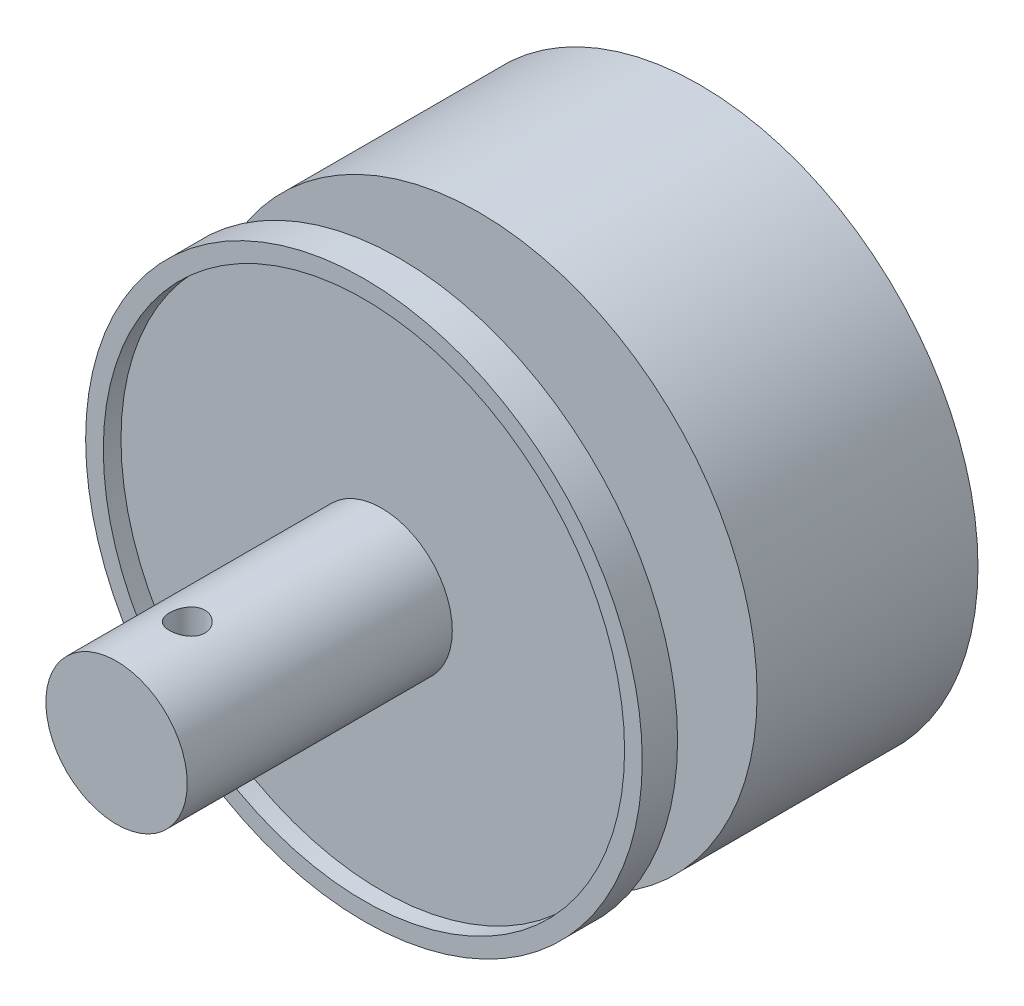
ISO-10303-21;
HEADER;
FILE_DESCRIPTION(('STEP AP214'),'2;1');
FILE_NAME('part.step','',(''),(''),'','','');
FILE_SCHEMA(('AUTOMOTIVE_DESIGN { 1 0 10303 214 1 1 1 1 }'));
ENDSEC;
DATA;
#1=APPLICATION_CONTEXT('core data for automotive mechanical design processes');
#2=APPLICATION_PROTOCOL_DEFINITION('international standard','automotive_design',2000,#1);
#3=PRODUCT_CONTEXT('',#1,'mechanical');
#4=PRODUCT('Part','Part','',(#3));
#5=PRODUCT_RELATED_PRODUCT_CATEGORY('part','',(#4));
#6=PRODUCT_DEFINITION_FORMATION('','',#4);
#7=PRODUCT_DEFINITION_CONTEXT('part definition',#1,'design');
#8=PRODUCT_DEFINITION('design','',#6,#7);
#9=PRODUCT_DEFINITION_SHAPE('','',#8);
#10=(LENGTH_UNIT() NAMED_UNIT(*) SI_UNIT(.MILLI.,.METRE.));
#11=(NAMED_UNIT(*) PLANE_ANGLE_UNIT() SI_UNIT($,.RADIAN.));
#12=(NAMED_UNIT(*) SI_UNIT($,.STERADIAN.) SOLID_ANGLE_UNIT());
#13=UNCERTAINTY_MEASURE_WITH_UNIT(LENGTH_MEASURE(1.E-05),#10,'distance_accuracy_value','');
#14=(GEOMETRIC_REPRESENTATION_CONTEXT(3) GLOBAL_UNCERTAINTY_ASSIGNED_CONTEXT((#13)) GLOBAL_UNIT_ASSIGNED_CONTEXT((#10,
#11,#12)) REPRESENTATION_CONTEXT('',''));
#15=CARTESIAN_POINT('',(0.,0.,0.));
#16=DIRECTION('',(0.,0.,1.));
#17=DIRECTION('',(1.,0.,0.));
#18=AXIS2_PLACEMENT_3D('',#15,#16,#17);
#19=CARTESIAN_POINT('',(0.,0.,25.));
#20=DIRECTION('',(0.,0.,-1.));
#21=DIRECTION('',(-1.,0.,0.));
#22=AXIS2_PLACEMENT_3D('',#19,#20,#21);
#23=CYLINDRICAL_SURFACE('',#22,31.5);
#24=CARTESIAN_POINT('',(0.,0.,25.));
#25=DIRECTION('',(0.,0.,1.));
#26=DIRECTION('',(1.,0.,0.));
#27=AXIS2_PLACEMENT_3D('',#24,#25,#26);
#28=CIRCLE('',#27,31.5);
#29=CARTESIAN_POINT('',(31.5,0.,25.));
#30=VERTEX_POINT('',#29);
#31=EDGE_CURVE('E10',#30,#30,#28,.T.);
#32=ORIENTED_EDGE('',*,*,#31,.F.);
#33=EDGE_LOOP('',(#32));
#34=FACE_BOUND('',#33,.T.);
#35=CARTESIAN_POINT('',(0.,0.,0.));
#36=DIRECTION('',(0.,0.,1.));
#37=DIRECTION('',(1.,0.,0.));
#38=AXIS2_PLACEMENT_3D('',#35,#36,#37);
#39=CIRCLE('',#38,31.5);
#40=CARTESIAN_POINT('',(31.5,0.,0.));
#41=VERTEX_POINT('',#40);
#42=EDGE_CURVE('E41',#41,#41,#39,.T.);
#43=ORIENTED_EDGE('',*,*,#42,.T.);
#44=EDGE_LOOP('',(#43));
#45=FACE_BOUND('',#44,.T.);
#46=ADVANCED_FACE('F30',(#34,#45),#23,.T.);
#47=CARTESIAN_POINT('',(0.,0.,25.));
#48=DIRECTION('',(0.,0.,1.));
#49=DIRECTION('',(1.,0.,0.));
#50=AXIS2_PLACEMENT_3D('',#47,#48,#49);
#51=PLANE('',#50);
#52=CARTESIAN_POINT('',(0.,0.,25.));
#53=DIRECTION('',(0.,0.,1.));
#54=DIRECTION('',(1.,0.,0.));
#55=AXIS2_PLACEMENT_3D('',#52,#53,#54);
#56=CIRCLE('',#55,5.);
#57=CARTESIAN_POINT('',(5.,0.,25.));
#58=VERTEX_POINT('',#57);
#59=EDGE_CURVE('E49',#58,#58,#56,.T.);
#60=ORIENTED_EDGE('',*,*,#59,.F.);
#61=EDGE_LOOP('',(#60));
#62=FACE_BOUND('',#61,.T.);
#63=ORIENTED_EDGE('',*,*,#31,.T.);
#64=EDGE_LOOP('',(#63));
#65=FACE_BOUND('',#64,.T.);
#66=ADVANCED_FACE('F74',(#62,#65),#51,.T.);
#67=CARTESIAN_POINT('',(0.,0.,0.));
#68=DIRECTION('',(0.,0.,1.));
#69=DIRECTION('',(1.,0.,0.));
#70=AXIS2_PLACEMENT_3D('',#67,#68,#69);
#71=PLANE('',#70);
#72=ORIENTED_EDGE('',*,*,#42,.F.);
#73=EDGE_LOOP('',(#72));
#74=FACE_BOUND('',#73,.T.);
#75=ADVANCED_FACE('F79',(#74),#71,.F.);
#76=CARTESIAN_POINT('',(0.,0.,34.));
#77=DIRECTION('',(0.,0.,-1.));
#78=DIRECTION('',(-1.,0.,0.));
#79=AXIS2_PLACEMENT_3D('',#76,#77,#78);
#80=CYLINDRICAL_SURFACE('',#79,5.);
#81=CARTESIAN_POINT('',(0.,0.,34.));
#82=DIRECTION('',(0.,0.,1.));
#83=DIRECTION('',(1.,0.,0.));
#84=AXIS2_PLACEMENT_3D('',#81,#82,#83);
#85=CIRCLE('',#84,5.);
#86=CARTESIAN_POINT('',(5.,0.,34.));
#87=VERTEX_POINT('',#86);
#88=EDGE_CURVE('E46',#87,#87,#85,.T.);
#89=ORIENTED_EDGE('',*,*,#88,.F.);
#90=EDGE_LOOP('',(#89));
#91=FACE_BOUND('',#90,.T.);
#92=ORIENTED_EDGE('',*,*,#59,.T.);
#93=EDGE_LOOP('',(#92));
#94=FACE_BOUND('',#93,.T.);
#95=ADVANCED_FACE('F86',(#91,#94),#80,.T.);
#96=CARTESIAN_POINT('',(0.,0.,38.));
#97=DIRECTION('',(0.,0.,-1.));
#98=DIRECTION('',(-1.,0.,0.));
#99=AXIS2_PLACEMENT_3D('',#96,#97,#98);
#100=CYLINDRICAL_SURFACE('',#99,31.5);
#101=CARTESIAN_POINT('',(0.,0.,38.));
#102=DIRECTION('',(0.,0.,1.));
#103=DIRECTION('',(1.,0.,0.));
#104=AXIS2_PLACEMENT_3D('',#101,#102,#103);
#105=CIRCLE('',#104,31.5);
#106=CARTESIAN_POINT('',(31.5,0.,38.));
#107=VERTEX_POINT('',#106);
#108=EDGE_CURVE('E123',#107,#107,#105,.T.);
#109=ORIENTED_EDGE('',*,*,#108,.F.);
#110=EDGE_LOOP('',(#109));
#111=FACE_BOUND('',#110,.T.);
#112=CARTESIAN_POINT('',(0.,0.,34.));
#113=DIRECTION('',(0.,0.,1.));
#114=DIRECTION('',(1.,0.,0.));
#115=AXIS2_PLACEMENT_3D('',#112,#113,#114);
#116=CIRCLE('',#115,31.5);
#117=CARTESIAN_POINT('',(31.5,0.,34.));
#118=VERTEX_POINT('',#117);
#119=EDGE_CURVE('E119',#118,#118,#116,.T.);
#120=ORIENTED_EDGE('',*,*,#119,.T.);
#121=EDGE_LOOP('',(#120));
#122=FACE_BOUND('',#121,.T.);
#123=ADVANCED_FACE('F90',(#111,#122),#100,.T.);
#124=CARTESIAN_POINT('',(0.,0.,38.));
#125=DIRECTION('',(0.,0.,1.));
#126=DIRECTION('',(1.,0.,0.));
#127=AXIS2_PLACEMENT_3D('',#124,#125,#126);
#128=PLANE('',#127);
#129=CARTESIAN_POINT('',(0.,0.,38.));
#130=DIRECTION('',(0.,0.,1.));
#131=DIRECTION('',(1.,0.,0.));
#132=AXIS2_PLACEMENT_3D('',#129,#130,#131);
#133=CIRCLE('',#132,29.5);
#134=CARTESIAN_POINT('',(29.5,0.,38.));
#135=VERTEX_POINT('',#134);
#136=EDGE_CURVE('E120',#135,#135,#133,.T.);
#137=ORIENTED_EDGE('',*,*,#136,.F.);
#138=EDGE_LOOP('',(#137));
#139=FACE_BOUND('',#138,.T.);
#140=ORIENTED_EDGE('',*,*,#108,.T.);
#141=EDGE_LOOP('',(#140));
#142=FACE_BOUND('',#141,.T.);
#143=ADVANCED_FACE('F96',(#139,#142),#128,.T.);
#144=CARTESIAN_POINT('',(0.,0.,34.));
#145=DIRECTION('',(0.,0.,1.));
#146=DIRECTION('',(1.,0.,0.));
#147=AXIS2_PLACEMENT_3D('',#144,#145,#146);
#148=PLANE('',#147);
#149=ORIENTED_EDGE('',*,*,#88,.T.);
#150=EDGE_LOOP('',(#149));
#151=FACE_BOUND('',#150,.T.);
#152=ORIENTED_EDGE('',*,*,#119,.F.);
#153=EDGE_LOOP('',(#152));
#154=FACE_BOUND('',#153,.T.);
#155=ADVANCED_FACE('F98',(#151,#154),#148,.F.);
#156=CARTESIAN_POINT('',(0.,0.,36.));
#157=DIRECTION('',(0.,0.,1.));
#158=DIRECTION('',(1.,0.,0.));
#159=AXIS2_PLACEMENT_3D('',#156,#157,#158);
#160=CYLINDRICAL_SURFACE('',#159,29.5);
#161=CARTESIAN_POINT('',(0.,0.,36.));
#162=DIRECTION('',(0.,0.,1.));
#163=DIRECTION('',(1.,0.,0.));
#164=AXIS2_PLACEMENT_3D('',#161,#162,#163);
#165=CIRCLE('',#164,29.5);
#166=CARTESIAN_POINT('',(29.5,0.,36.));
#167=VERTEX_POINT('',#166);
#168=EDGE_CURVE('E118',#167,#167,#165,.T.);
#169=ORIENTED_EDGE('',*,*,#168,.F.);
#170=EDGE_LOOP('',(#169));
#171=FACE_BOUND('',#170,.T.);
#172=ORIENTED_EDGE('',*,*,#136,.T.);
#173=EDGE_LOOP('',(#172));
#174=FACE_BOUND('',#173,.T.);
#175=ADVANCED_FACE('F101',(#171,#174),#160,.F.);
#176=CARTESIAN_POINT('',(0.,0.,36.));
#177=DIRECTION('',(0.,0.,1.));
#178=DIRECTION('',(1.,0.,0.));
#179=AXIS2_PLACEMENT_3D('',#176,#177,#178);
#180=PLANE('',#179);
#181=CARTESIAN_POINT('',(0.,0.,36.));
#182=DIRECTION('',(0.,0.,1.));
#183=DIRECTION('',(1.,0.,0.));
#184=AXIS2_PLACEMENT_3D('',#181,#182,#183);
#185=CIRCLE('',#184,8.);
#186=CARTESIAN_POINT('',(8.,0.,36.));
#187=VERTEX_POINT('',#186);
#188=EDGE_CURVE('E115',#187,#187,#185,.T.);
#189=ORIENTED_EDGE('',*,*,#188,.F.);
#190=EDGE_LOOP('',(#189));
#191=FACE_BOUND('',#190,.T.);
#192=ORIENTED_EDGE('',*,*,#168,.T.);
#193=EDGE_LOOP('',(#192));
#194=FACE_BOUND('',#193,.T.);
#195=ADVANCED_FACE('F70',(#191,#194),#180,.T.);
#196=CARTESIAN_POINT('',(0.,0.,66.));
#197=DIRECTION('',(0.,0.,-1.));
#198=DIRECTION('',(-1.,0.,0.));
#199=AXIS2_PLACEMENT_3D('',#196,#197,#198);
#200=CYLINDRICAL_SURFACE('',#199,8.);
#201=CARTESIAN_POINT('',(0.,-8.,60.));
#202=CARTESIAN_POINT('',(0.11050145155965,-7.99999813157349,59.9999968990158));
#203=CARTESIAN_POINT('',(0.22103754377436,-7.99768770842435,59.990811265635));
#204=CARTESIAN_POINT('',(0.438941765027386,-7.98869485106526,59.954366464924));
#205=CARTESIAN_POINT('',(0.546308062494328,-7.98200993893301,59.9270970539495));
#206=CARTESIAN_POINT('',(0.754694496243445,-7.96500835109376,59.8554143287172));
#207=CARTESIAN_POINT('',(0.855722084573345,-7.95469603789411,59.811021601713));
#208=CARTESIAN_POINT('',(1.04889617587258,-7.93153791743495,59.7064248132736));
#209=CARTESIAN_POINT('',(1.14104237913169,-7.91869202472208,59.646220218508));
#210=CARTESIAN_POINT('',(1.3157359030679,-7.89156551455591,59.5103989471278));
#211=CARTESIAN_POINT('',(1.39807425341475,-7.87726276197501,59.4345179000546));
#212=CARTESIAN_POINT('',(1.54899856960443,-7.84898160157248,59.270063726788));
#213=CARTESIAN_POINT('',(1.61758298259893,-7.83500323053157,59.1814891694041));
#214=CARTESIAN_POINT('',(1.74003539039864,-7.80873034264224,58.992539697684));
#215=CARTESIAN_POINT('',(1.79366962123353,-7.79646392619748,58.8920090255884));
#216=CARTESIAN_POINT('',(1.88319587806767,-7.77532659757355,58.6830021177866));
#217=CARTESIAN_POINT('',(1.91909074058686,-7.76645514259224,58.5745271555573));
#218=CARTESIAN_POINT('',(1.97140644907303,-7.7533396892843,58.3550086690645));
#219=CARTESIAN_POINT('',(1.98820302444275,-7.74900654662681,58.244060138616));
#220=CARTESIAN_POINT('',(2.00301570008855,-7.74519149946122,58.0208419080009));
#221=CARTESIAN_POINT('',(2.00103485575749,-7.74570880570571,57.9085724257438));
#222=CARTESIAN_POINT('',(1.97864869951962,-7.75145607355756,57.6887789230062));
#223=CARTESIAN_POINT('',(1.95869112025419,-7.75657150676391,57.5812058380462));
#224=CARTESIAN_POINT('',(1.901632249204,-7.77075612894758,57.3709852654519));
#225=CARTESIAN_POINT('',(1.86452973609253,-7.77982559958985,57.2683381292948));
#226=CARTESIAN_POINT('',(1.77385263724959,-7.80100151874212,57.0696826449972));
#227=CARTESIAN_POINT('',(1.72011555631057,-7.81313769959754,56.9737517709472));
#228=CARTESIAN_POINT('',(1.59780836801994,-7.83906281127988,56.7921083869909));
#229=CARTESIAN_POINT('',(1.52923566507846,-7.85285203112837,56.7063976692437));
#230=CARTESIAN_POINT('',(1.37688456624163,-7.88101174053188,56.5450618457408));
#231=CARTESIAN_POINT('',(1.29272834422116,-7.89538759304001,56.4697940132515));
#232=CARTESIAN_POINT('',(1.11281589000494,-7.92274620771675,56.3343716767148));
#233=CARTESIAN_POINT('',(1.0170593036106,-7.93572892732543,56.2742176343152));
#234=CARTESIAN_POINT('',(0.816154518241867,-7.9589030945892,56.1705992183675));
#235=CARTESIAN_POINT('',(0.710975190944843,-7.96908480170303,56.1271928796608));
#236=CARTESIAN_POINT('',(0.494501344190523,-7.98543889321888,56.0587769257206));
#237=CARTESIAN_POINT('',(0.383207998867325,-7.99161204452374,56.0337637914425));
#238=CARTESIAN_POINT('',(0.160719960520048,-7.999139990285,56.0033899125882));
#239=CARTESIAN_POINT('',(0.0495956266509575,-8.00061404677705,55.9975426318996));
#240=CARTESIAN_POINT('',(-0.172043833068667,-7.99891739752601,56.0043320027407));
#241=CARTESIAN_POINT('',(-0.28255901285945,-7.99574710989128,56.0169669903988));
#242=CARTESIAN_POINT('',(-0.498152358368646,-7.98519441503143,56.0599612111885));
#243=CARTESIAN_POINT('',(-0.603286825291664,-7.97787512247749,56.0900550179693));
#244=CARTESIAN_POINT('',(-0.807009723270006,-7.95984942178846,56.1668094453713));
#245=CARTESIAN_POINT('',(-0.905597492043504,-7.94914267159856,56.2134717390842));
#246=CARTESIAN_POINT('',(-1.09536417923979,-7.92524410568414,56.3229815051663));
#247=CARTESIAN_POINT('',(-1.18638058911443,-7.91201156489243,56.3861014831957));
#248=CARTESIAN_POINT('',(-1.35670215152432,-7.88459345583226,56.5263865450626));
#249=CARTESIAN_POINT('',(-1.43600527863067,-7.87040772335606,56.6035540528225));
#250=CARTESIAN_POINT('',(-1.58265409076363,-7.84225275947695,56.7720026144593));
#251=CARTESIAN_POINT('',(-1.6496584901627,-7.82829738916375,56.8635836040032));
#252=CARTESIAN_POINT('',(-1.76734767868359,-7.80257171169652,57.0569768459543));
#253=CARTESIAN_POINT('',(-1.81803319221057,-7.79080130756035,57.1587886439463));
#254=CARTESIAN_POINT('',(-1.90126856081238,-7.77090792979554,57.3692076298841));
#255=CARTESIAN_POINT('',(-1.93392586220541,-7.76276340389208,57.4777701711253));
#256=CARTESIAN_POINT('',(-1.98046087993836,-7.75102325453578,57.6990795171855));
#257=CARTESIAN_POINT('',(-1.99434270330487,-7.74742663626582,57.8118254013767));
#258=CARTESIAN_POINT('',(-2.00271812044532,-7.74526534938609,58.0348280318069));
#259=CARTESIAN_POINT('',(-1.99775719704015,-7.74655910304352,58.145063246833));
#260=CARTESIAN_POINT('',(-1.96983637108382,-7.75370545343791,58.3630718515573));
#261=CARTESIAN_POINT('',(-1.94687683024902,-7.75955795855809,58.4708452906849));
#262=CARTESIAN_POINT('',(-1.88390842592372,-7.77508347576963,58.6802779454205));
#263=CARTESIAN_POINT('',(-1.84400187290716,-7.78473353648413,58.7819697403203));
#264=CARTESIAN_POINT('',(-1.74835321814009,-7.80677007633105,58.9772871769516));
#265=CARTESIAN_POINT('',(-1.69260892004558,-7.81915693494364,59.0709116975826));
#266=CARTESIAN_POINT('',(-1.56515699818284,-7.8456751235135,59.2500728386694));
#267=CARTESIAN_POINT('',(-1.493070883883,-7.85984353109009,59.3353347645653));
#268=CARTESIAN_POINT('',(-1.33571916158631,-7.88810702995048,59.4927293930605));
#269=CARTESIAN_POINT('',(-1.25045042834819,-7.90220210302746,59.564858973484));
#270=CARTESIAN_POINT('',(-1.06729011560345,-7.92903540863551,59.6952150780861));
#271=CARTESIAN_POINT('',(-0.969197896421842,-7.94174444487824,59.7531661515621));
#272=CARTESIAN_POINT('',(-0.764354746013962,-7.96406566633491,59.8516632839207));
#273=CARTESIAN_POINT('',(-0.657610084582313,-7.97368006933042,59.8922218141981));
#274=CARTESIAN_POINT('',(-0.459213670991288,-7.98730746087389,59.9487624404395));
#275=CARTESIAN_POINT('',(-0.368506894544084,-7.99203446736921,59.9679349907379));
#276=CARTESIAN_POINT('',(-0.185208095381703,-7.99838140309265,59.9935545914959));
#277=CARTESIAN_POINT('',(-0.0926162149901467,-8.00000156601193,60.0000025990737));
#278=CARTESIAN_POINT('',(0.,-8.,60.));
#279=B_SPLINE_CURVE_WITH_KNOTS('',3,(#201,#202,#203,#204,#205,#206,#207,#208,#209,#210,#211,
#212,#213,#214,#215,#216,#217,#218,#219,#220,#221,#222,#223,#224,#225,#226,#227,#228,#229,#230,
#231,#232,#233,#234,#235,#236,#237,#238,#239,#240,#241,#242,#243,#244,#245,#246,#247,#248,#249,
#250,#251,#252,#253,#254,#255,#256,#257,#258,#259,#260,#261,#262,#263,#264,#265,#266,#267,#268,
#269,#270,#271,#272,#273,#274,#275,#276,#277,#278),.UNSPECIFIED.,.T.,.F.,(4,2,2,2,2,2,2,2,2,2,2,
2,2,2,2,2,2,2,2,2,2,2,2,2,2,2,2,2,2,2,2,2,2,2,2,2,2,2,4),(0.,0.33116494996252,0.662517650351866,
0.99347320304814,1.32443992022577,1.66152580582852,1.99864972773415,2.34078196727743,
2.68285948225824,3.01808393468094,3.35325384154691,3.68029996013786,4.00736937959146,
4.337740371696,4.66816921119312,5.00802001296454,5.34788119415424,5.6889097201658,
6.02987298255952,6.36211078603463,6.69431868154752,7.02160366023145,7.34892169767482,
7.68204783424898,8.01523150681787,8.35659345610397,8.69794025003773,9.03723006156476,
9.37644564340972,9.70591707202579,10.0353818794581,10.3628853408369,10.6904342418696,
11.0265276855098,11.3627009303165,11.7049624733721,12.046978184329,12.3245632392729,
12.6021274139515),.UNSPECIFIED.);
#280=CARTESIAN_POINT('',(0.,-8.,60.));
#281=VERTEX_POINT('',#280);
#282=EDGE_CURVE('E33',#281,#281,#279,.T.);
#283=ORIENTED_EDGE('',*,*,#282,.T.);
#284=EDGE_LOOP('',(#283));
#285=FACE_BOUND('',#284,.T.);
#286=CARTESIAN_POINT('',(0.,8.,60.));
#287=CARTESIAN_POINT('',(-0.110501451559633,7.9999981315735,59.9999968990158));
#288=CARTESIAN_POINT('',(-0.221037543774342,7.99768770842435,59.990811265635));
#289=CARTESIAN_POINT('',(-0.438941765027369,7.98869485106526,59.954366464924));
#290=CARTESIAN_POINT('',(-0.546308062494311,7.98200993893301,59.9270970539495));
#291=CARTESIAN_POINT('',(-0.754694496243428,7.96500835109376,59.8554143287172));
#292=CARTESIAN_POINT('',(-0.855722084573328,7.95469603789411,59.811021601713));
#293=CARTESIAN_POINT('',(-1.04889617587256,7.93153791743495,59.7064248132736));
#294=CARTESIAN_POINT('',(-1.14104237913168,7.91869202472208,59.646220218508));
#295=CARTESIAN_POINT('',(-1.31573590306788,7.89156551455591,59.5103989471278));
#296=CARTESIAN_POINT('',(-1.39807425341473,7.87726276197502,59.4345179000546));
#297=CARTESIAN_POINT('',(-1.54899856960442,7.84898160157249,59.270063726788));
#298=CARTESIAN_POINT('',(-1.61758298259891,7.83500323053157,59.1814891694041));
#299=CARTESIAN_POINT('',(-1.74003539039862,7.80873034264225,58.992539697684));
#300=CARTESIAN_POINT('',(-1.79366962123351,7.79646392619748,58.8920090255884));
#301=CARTESIAN_POINT('',(-1.88319587806765,7.77532659757355,58.6830021177866));
#302=CARTESIAN_POINT('',(-1.91909074058685,7.76645514259225,58.5745271555573));
#303=CARTESIAN_POINT('',(-1.97140644907301,7.75333968928431,58.3550086690645));
#304=CARTESIAN_POINT('',(-1.98820302444273,7.74900654662682,58.244060138616));
#305=CARTESIAN_POINT('',(-2.00301570008854,7.74519149946122,58.0208419080009));
#306=CARTESIAN_POINT('',(-2.00103485575747,7.74570880570572,57.9085724257438));
#307=CARTESIAN_POINT('',(-1.9786486995196,7.75145607355756,57.6887789230062));
#308=CARTESIAN_POINT('',(-1.95869112025417,7.75657150676392,57.5812058380462));
#309=CARTESIAN_POINT('',(-1.90163224920398,7.77075612894759,57.3709852654519));
#310=CARTESIAN_POINT('',(-1.86452973609252,7.77982559958985,57.2683381292948));
#311=CARTESIAN_POINT('',(-1.77385263724957,7.80100151874212,57.0696826449972));
#312=CARTESIAN_POINT('',(-1.72011555631055,7.81313769959755,56.9737517709472));
#313=CARTESIAN_POINT('',(-1.59780836801992,7.83906281127988,56.7921083869909));
#314=CARTESIAN_POINT('',(-1.52923566507844,7.85285203112837,56.7063976692437));
#315=CARTESIAN_POINT('',(-1.37688456624162,7.88101174053189,56.5450618457408));
#316=CARTESIAN_POINT('',(-1.29272834422114,7.89538759304001,56.4697940132515));
#317=CARTESIAN_POINT('',(-1.11281589000492,7.92274620771675,56.3343716767148));
#318=CARTESIAN_POINT('',(-1.01705930361058,7.93572892732543,56.2742176343152));
#319=CARTESIAN_POINT('',(-0.816154518241848,7.9589030945892,56.1705992183675));
#320=CARTESIAN_POINT('',(-0.710975190944822,7.96908480170303,56.1271928796608));
#321=CARTESIAN_POINT('',(-0.4945013441905,7.98543889321888,56.0587769257206));
#322=CARTESIAN_POINT('',(-0.383207998867301,7.99161204452374,56.0337637914425));
#323=CARTESIAN_POINT('',(-0.160719960520024,7.999139990285,56.0033899125882));
#324=CARTESIAN_POINT('',(-0.0495956266509351,8.00061404677705,55.9975426318996));
#325=CARTESIAN_POINT('',(0.172043833068688,7.99891739752601,56.0043320027407));
#326=CARTESIAN_POINT('',(0.282559012859469,7.99574710989128,56.0169669903988));
#327=CARTESIAN_POINT('',(0.498152358368665,7.98519441503143,56.0599612111885));
#328=CARTESIAN_POINT('',(0.603286825291682,7.97787512247748,56.0900550179693));
#329=CARTESIAN_POINT('',(0.807009723270024,7.95984942178845,56.1668094453713));
#330=CARTESIAN_POINT('',(0.905597492043521,7.94914267159856,56.2134717390842));
#331=CARTESIAN_POINT('',(1.09536417923981,7.92524410568414,56.3229815051663));
#332=CARTESIAN_POINT('',(1.18638058911445,7.91201156489243,56.3861014831957));
#333=CARTESIAN_POINT('',(1.35670215152434,7.88459345583225,56.5263865450626));
#334=CARTESIAN_POINT('',(1.43600527863069,7.87040772335606,56.6035540528225));
#335=CARTESIAN_POINT('',(1.58265409076365,7.84225275947695,56.7720026144593));
#336=CARTESIAN_POINT('',(1.64965849016272,7.82829738916374,56.8635836040032));
#337=CARTESIAN_POINT('',(1.76734767868361,7.80257171169651,57.0569768459543));
#338=CARTESIAN_POINT('',(1.81803319221059,7.79080130756034,57.1587886439463));
#339=CARTESIAN_POINT('',(1.9012685608124,7.77090792979553,57.3692076298841));
#340=CARTESIAN_POINT('',(1.93392586220543,7.76276340389207,57.4777701711253));
#341=CARTESIAN_POINT('',(1.98046087993838,7.75102325453578,57.6990795171855));
#342=CARTESIAN_POINT('',(1.99434270330489,7.74742663626581,57.8118254013767));
#343=CARTESIAN_POINT('',(2.00271812044534,7.74526534938609,58.0348280318069));
#344=CARTESIAN_POINT('',(1.99775719704017,7.74655910304351,58.145063246833));
#345=CARTESIAN_POINT('',(1.96983637108383,7.7537054534379,58.3630718515573));
#346=CARTESIAN_POINT('',(1.94687683024904,7.75955795855809,58.4708452906849));
#347=CARTESIAN_POINT('',(1.88390842592374,7.77508347576963,58.6802779454205));
#348=CARTESIAN_POINT('',(1.84400187290718,7.78473353648412,58.7819697403203));
#349=CARTESIAN_POINT('',(1.7483532181401,7.80677007633105,58.9772871769516));
#350=CARTESIAN_POINT('',(1.69260892004559,7.81915693494364,59.0709116975826));
#351=CARTESIAN_POINT('',(1.56515699818286,7.84567512351349,59.2500728386694));
#352=CARTESIAN_POINT('',(1.49307088388302,7.85984353109009,59.3353347645653));
#353=CARTESIAN_POINT('',(1.33571916158632,7.88810702995047,59.4927293930605));
#354=CARTESIAN_POINT('',(1.2504504283482,7.90220210302746,59.564858973484));
#355=CARTESIAN_POINT('',(1.06729011560346,7.9290354086355,59.6952150780861));
#356=CARTESIAN_POINT('',(0.969197896421859,7.94174444487824,59.7531661515621));
#357=CARTESIAN_POINT('',(0.764354746013979,7.96406566633491,59.8516632839207));
#358=CARTESIAN_POINT('',(0.65761008458233,7.97368006933042,59.8922218141981));
#359=CARTESIAN_POINT('',(0.459213670991305,7.98730746087389,59.9487624404395));
#360=CARTESIAN_POINT('',(0.368506894544101,7.9920344673692,59.9679349907379));
#361=CARTESIAN_POINT('',(0.18520809538172,7.99838140309264,59.9935545914959));
#362=CARTESIAN_POINT('',(0.0926162149901641,8.00000156601192,60.0000025990737));
#363=CARTESIAN_POINT('',(0.,8.,60.));
#364=B_SPLINE_CURVE_WITH_KNOTS('',3,(#286,#287,#288,#289,#290,#291,#292,#293,#294,#295,#296,
#297,#298,#299,#300,#301,#302,#303,#304,#305,#306,#307,#308,#309,#310,#311,#312,#313,#314,#315,
#316,#317,#318,#319,#320,#321,#322,#323,#324,#325,#326,#327,#328,#329,#330,#331,#332,#333,#334,
#335,#336,#337,#338,#339,#340,#341,#342,#343,#344,#345,#346,#347,#348,#349,#350,#351,#352,#353,
#354,#355,#356,#357,#358,#359,#360,#361,#362,#363),.UNSPECIFIED.,.T.,.F.,(4,2,2,2,2,2,2,2,2,2,2,
2,2,2,2,2,2,2,2,2,2,2,2,2,2,2,2,2,2,2,2,2,2,2,2,2,2,2,4),(0.,0.33116494996252,0.662517650351866,
0.99347320304814,1.32443992022577,1.66152580582852,1.99864972773415,2.34078196727743,
2.68285948225824,3.01808393468094,3.35325384154691,3.68029996013786,4.00736937959146,
4.337740371696,4.66816921119312,5.00802001296454,5.34788119415424,5.6889097201658,
6.02987298255952,6.36211078603463,6.69431868154752,7.02160366023144,7.34892169767482,
7.68204783424898,8.01523150681787,8.35659345610396,8.69794025003773,9.03723006156476,
9.37644564340972,9.70591707202578,10.0353818794581,10.3628853408369,10.6904342418696,
11.0265276855098,11.3627009303165,11.7049624733721,12.0469781843289,12.3245632392729,
12.6021274139515),.UNSPECIFIED.);
#365=CARTESIAN_POINT('',(0.,8.,60.));
#366=VERTEX_POINT('',#365);
#367=EDGE_CURVE('E51',#366,#366,#364,.T.);
#368=ORIENTED_EDGE('',*,*,#367,.T.);
#369=EDGE_LOOP('',(#368));
#370=FACE_BOUND('',#369,.T.);
#371=CARTESIAN_POINT('',(0.,0.,66.));
#372=DIRECTION('',(0.,0.,1.));
#373=DIRECTION('',(1.,0.,0.));
#374=AXIS2_PLACEMENT_3D('',#371,#372,#373);
#375=CIRCLE('',#374,8.);
#376=CARTESIAN_POINT('',(8.,0.,66.));
#377=VERTEX_POINT('',#376);
#378=EDGE_CURVE('E126',#377,#377,#375,.T.);
#379=ORIENTED_EDGE('',*,*,#378,.F.);
#380=EDGE_LOOP('',(#379));
#381=FACE_BOUND('',#380,.T.);
#382=ORIENTED_EDGE('',*,*,#188,.T.);
#383=EDGE_LOOP('',(#382));
#384=FACE_BOUND('',#383,.T.);
#385=ADVANCED_FACE('F55',(#285,#370,#381,#384),#200,.T.);
#386=CARTESIAN_POINT('',(0.,0.,66.));
#387=DIRECTION('',(0.,0.,1.));
#388=DIRECTION('',(1.,0.,0.));
#389=AXIS2_PLACEMENT_3D('',#386,#387,#388);
#390=PLANE('',#389);
#391=ORIENTED_EDGE('',*,*,#378,.T.);
#392=EDGE_LOOP('',(#391));
#393=FACE_BOUND('',#392,.T.);
#394=ADVANCED_FACE('F62',(#393),#390,.T.);
#395=CARTESIAN_POINT('',(0.,-20.,58.));
#396=DIRECTION('',(0.,1.,0.));
#397=DIRECTION('',(0.,0.,1.));
#398=AXIS2_PLACEMENT_3D('',#395,#396,#397);
#399=CYLINDRICAL_SURFACE('',#398,2.);
#400=ORIENTED_EDGE('',*,*,#367,.F.);
#401=EDGE_LOOP('',(#400));
#402=FACE_BOUND('',#401,.T.);
#403=ORIENTED_EDGE('',*,*,#282,.F.);
#404=EDGE_LOOP('',(#403));
#405=FACE_BOUND('',#404,.T.);
#406=ADVANCED_FACE('F59',(#402,#405),#399,.F.);
#407=CLOSED_SHELL('',(#46,#66,#75,#95,#123,#143,#155,#175,#195,#385,#394,#406));
#408=MANIFOLD_SOLID_BREP('B2',#407);
#409=ADVANCED_BREP_SHAPE_REPRESENTATION('',(#18,#408),#14);
#410=SHAPE_DEFINITION_REPRESENTATION(#9,#409);
ENDSEC;
END-ISO-10303-21;
